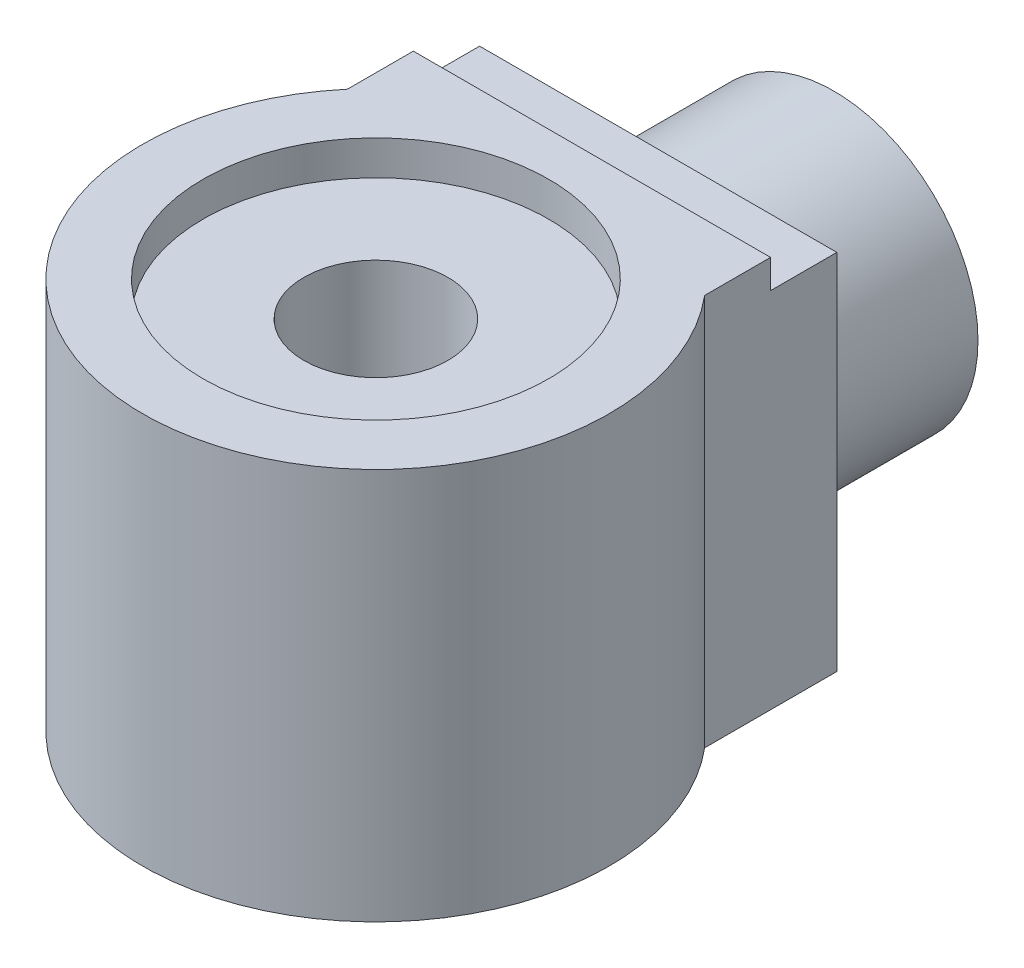
ISO-10303-21;
HEADER;
FILE_DESCRIPTION(('STEP AP214'),'2;1');
FILE_NAME('part.step','',(''),(''),'','','');
FILE_SCHEMA(('AUTOMOTIVE_DESIGN { 1 0 10303 214 1 1 1 1 }'));
ENDSEC;
DATA;
#1=APPLICATION_CONTEXT('core data for automotive mechanical design processes');
#2=APPLICATION_PROTOCOL_DEFINITION('international standard','automotive_design',2000,#1);
#3=PRODUCT_CONTEXT('',#1,'mechanical');
#4=PRODUCT('Part','Part','',(#3));
#5=PRODUCT_RELATED_PRODUCT_CATEGORY('part','',(#4));
#6=PRODUCT_DEFINITION_FORMATION('','',#4);
#7=PRODUCT_DEFINITION_CONTEXT('part definition',#1,'design');
#8=PRODUCT_DEFINITION('design','',#6,#7);
#9=PRODUCT_DEFINITION_SHAPE('','',#8);
#10=(LENGTH_UNIT() NAMED_UNIT(*) SI_UNIT(.MILLI.,.METRE.));
#11=(NAMED_UNIT(*) PLANE_ANGLE_UNIT() SI_UNIT($,.RADIAN.));
#12=(NAMED_UNIT(*) SI_UNIT($,.STERADIAN.) SOLID_ANGLE_UNIT());
#13=UNCERTAINTY_MEASURE_WITH_UNIT(LENGTH_MEASURE(1.E-05),#10,'distance_accuracy_value','');
#14=(GEOMETRIC_REPRESENTATION_CONTEXT(3) GLOBAL_UNCERTAINTY_ASSIGNED_CONTEXT((#13)) GLOBAL_UNIT_ASSIGNED_CONTEXT((#10,
#11,#12)) REPRESENTATION_CONTEXT('',''));
#15=CARTESIAN_POINT('',(0.,0.,0.));
#16=DIRECTION('',(0.,0.,1.));
#17=DIRECTION('',(1.,0.,0.));
#18=AXIS2_PLACEMENT_3D('',#15,#16,#17);
#19=CARTESIAN_POINT('',(15.748,34.544,-24.892));
#20=DIRECTION('',(0.,0.,1.));
#21=DIRECTION('',(1.,0.,0.));
#22=AXIS2_PLACEMENT_3D('',#19,#20,#21);
#23=PLANE('',#22);
#24=CARTESIAN_POINT('',(0.,16.002,-24.892));
#25=DIRECTION('',(0.,0.,1.));
#26=DIRECTION('',(1.,0.,0.));
#27=AXIS2_PLACEMENT_3D('',#24,#25,#26);
#28=CIRCLE('',#27,12.7);
#29=CARTESIAN_POINT('',(12.7,16.002,-24.892));
#30=VERTEX_POINT('',#29);
#31=EDGE_CURVE('E11',#30,#30,#28,.F.);
#32=ORIENTED_EDGE('',*,*,#31,.F.);
#33=EDGE_LOOP('',(#32));
#34=FACE_BOUND('',#33,.T.);
#35=DIRECTION('',(-1.,0.,0.));
#36=VECTOR('',#35,1.);
#37=CARTESIAN_POINT('',(-15.748,32.004,-24.892));
#38=LINE('',#37,#36);
#39=CARTESIAN_POINT('',(15.748,32.004,-24.892));
#40=VERTEX_POINT('',#39);
#41=CARTESIAN_POINT('',(-15.748,32.004,-24.892));
#42=VERTEX_POINT('',#41);
#43=EDGE_CURVE('E119',#40,#42,#38,.T.);
#44=ORIENTED_EDGE('',*,*,#43,.F.);
#45=DIRECTION('',(0.,-1.,0.));
#46=VECTOR('',#45,1.);
#47=CARTESIAN_POINT('',(15.748,34.544,-24.892));
#48=LINE('',#47,#46);
#49=CARTESIAN_POINT('',(15.748,0.,-24.892));
#50=VERTEX_POINT('',#49);
#51=EDGE_CURVE('E43',#40,#50,#48,.T.);
#52=ORIENTED_EDGE('',*,*,#51,.T.);
#53=DIRECTION('',(-1.,0.,0.));
#54=VECTOR('',#53,1.);
#55=CARTESIAN_POINT('',(15.748,0.,-24.892));
#56=LINE('',#55,#54);
#57=CARTESIAN_POINT('',(-15.748,0.,-24.892));
#58=VERTEX_POINT('',#57);
#59=EDGE_CURVE('E101',#50,#58,#56,.T.);
#60=ORIENTED_EDGE('',*,*,#59,.T.);
#61=DIRECTION('',(0.,-1.,0.));
#62=VECTOR('',#61,1.);
#63=CARTESIAN_POINT('',(-15.748,34.544,-24.892));
#64=LINE('',#63,#62);
#65=EDGE_CURVE('E113',#42,#58,#64,.T.);
#66=ORIENTED_EDGE('',*,*,#65,.F.);
#67=EDGE_LOOP('',(#44,#52,#60,#66));
#68=FACE_BOUND('',#67,.T.);
#69=ADVANCED_FACE('F35',(#34,#68),#23,.F.);
#70=CARTESIAN_POINT('',(15.748,34.544,-24.892));
#71=DIRECTION('',(-1.,0.,0.));
#72=DIRECTION('',(0.,0.,1.));
#73=AXIS2_PLACEMENT_3D('',#70,#71,#72);
#74=PLANE('',#73);
#75=DIRECTION('',(0.,0.,-1.));
#76=VECTOR('',#75,1.);
#77=CARTESIAN_POINT('',(15.748,32.004,-24.892));
#78=LINE('',#77,#76);
#79=CARTESIAN_POINT('',(15.748,32.004,-19.05));
#80=VERTEX_POINT('',#79);
#81=EDGE_CURVE('E122',#80,#40,#78,.T.);
#82=ORIENTED_EDGE('',*,*,#81,.F.);
#83=DIRECTION('',(0.,1.,0.));
#84=VECTOR('',#83,1.);
#85=CARTESIAN_POINT('',(15.748,32.004,-19.05));
#86=LINE('',#85,#84);
#87=CARTESIAN_POINT('',(15.748,34.544,-19.05));
#88=VERTEX_POINT('',#87);
#89=EDGE_CURVE('E136',#80,#88,#86,.T.);
#90=ORIENTED_EDGE('',*,*,#89,.T.);
#91=DIRECTION('',(0.,0.,-1.));
#92=VECTOR('',#91,1.);
#93=CARTESIAN_POINT('',(15.748,34.544,-24.892));
#94=LINE('',#93,#92);
#95=CARTESIAN_POINT('',(15.748,34.544,-13.2397119304009));
#96=VERTEX_POINT('',#95);
#97=EDGE_CURVE('E88',#96,#88,#94,.T.);
#98=ORIENTED_EDGE('',*,*,#97,.F.);
#99=DIRECTION('',(0.,-1.,0.));
#100=VECTOR('',#99,1.);
#101=CARTESIAN_POINT('',(15.748,34.544,-13.2397119304009));
#102=LINE('',#101,#100);
#103=CARTESIAN_POINT('',(15.748,0.,-13.2397119304009));
#104=VERTEX_POINT('',#103);
#105=EDGE_CURVE('E81',#96,#104,#102,.T.);
#106=ORIENTED_EDGE('',*,*,#105,.T.);
#107=DIRECTION('',(0.,0.,-1.));
#108=VECTOR('',#107,1.);
#109=CARTESIAN_POINT('',(15.748,0.,-24.892));
#110=LINE('',#109,#108);
#111=EDGE_CURVE('E95',#104,#50,#110,.T.);
#112=ORIENTED_EDGE('',*,*,#111,.T.);
#113=ORIENTED_EDGE('',*,*,#51,.F.);
#114=EDGE_LOOP('',(#82,#90,#98,#106,#112,#113));
#115=FACE_BOUND('',#114,.T.);
#116=ADVANCED_FACE('F37',(#115),#74,.F.);
#117=CARTESIAN_POINT('',(-15.748,34.544,-24.892));
#118=DIRECTION('',(1.,0.,0.));
#119=DIRECTION('',(0.,0.,-1.));
#120=AXIS2_PLACEMENT_3D('',#117,#118,#119);
#121=PLANE('',#120);
#122=DIRECTION('',(0.,0.,1.));
#123=VECTOR('',#122,1.);
#124=CARTESIAN_POINT('',(-15.748,34.544,-24.892));
#125=LINE('',#124,#123);
#126=CARTESIAN_POINT('',(-15.748,34.544,-19.05));
#127=VERTEX_POINT('',#126);
#128=CARTESIAN_POINT('',(-15.748,34.544,-13.2397119304009));
#129=VERTEX_POINT('',#128);
#130=EDGE_CURVE('E145',#127,#129,#125,.T.);
#131=ORIENTED_EDGE('',*,*,#130,.F.);
#132=DIRECTION('',(0.,1.,0.));
#133=VECTOR('',#132,1.);
#134=CARTESIAN_POINT('',(-15.748,32.004,-19.05));
#135=LINE('',#134,#133);
#136=CARTESIAN_POINT('',(-15.748,32.004,-19.05));
#137=VERTEX_POINT('',#136);
#138=EDGE_CURVE('E50',#137,#127,#135,.T.);
#139=ORIENTED_EDGE('',*,*,#138,.F.);
#140=DIRECTION('',(0.,0.,1.));
#141=VECTOR('',#140,1.);
#142=CARTESIAN_POINT('',(-15.748,32.004,-24.892));
#143=LINE('',#142,#141);
#144=EDGE_CURVE('E137',#42,#137,#143,.T.);
#145=ORIENTED_EDGE('',*,*,#144,.F.);
#146=ORIENTED_EDGE('',*,*,#65,.T.);
#147=DIRECTION('',(0.,0.,1.));
#148=VECTOR('',#147,1.);
#149=CARTESIAN_POINT('',(-15.748,0.,-24.892));
#150=LINE('',#149,#148);
#151=CARTESIAN_POINT('',(-15.748,0.,-13.2397119304009));
#152=VERTEX_POINT('',#151);
#153=EDGE_CURVE('E89',#58,#152,#150,.T.);
#154=ORIENTED_EDGE('',*,*,#153,.T.);
#155=DIRECTION('',(0.,-1.,0.));
#156=VECTOR('',#155,1.);
#157=CARTESIAN_POINT('',(-15.748,34.544,-13.2397119304009));
#158=LINE('',#157,#156);
#159=EDGE_CURVE('E84',#129,#152,#158,.T.);
#160=ORIENTED_EDGE('',*,*,#159,.F.);
#161=EDGE_LOOP('',(#131,#139,#145,#146,#154,#160));
#162=FACE_BOUND('',#161,.T.);
#163=ADVANCED_FACE('F144',(#162),#121,.F.);
#164=CARTESIAN_POINT('',(0.,34.544,0.));
#165=DIRECTION('',(0.,-1.,0.));
#166=DIRECTION('',(0.,0.,-1.));
#167=AXIS2_PLACEMENT_3D('',#164,#165,#166);
#168=CYLINDRICAL_SURFACE('',#167,20.574);
#169=CARTESIAN_POINT('',(0.,0.,0.));
#170=DIRECTION('',(0.,1.,0.));
#171=DIRECTION('',(0.,0.,1.));
#172=AXIS2_PLACEMENT_3D('',#169,#170,#171);
#173=CIRCLE('',#172,20.574);
#174=EDGE_CURVE('E78',#152,#104,#173,.T.);
#175=ORIENTED_EDGE('',*,*,#174,.T.);
#176=ORIENTED_EDGE('',*,*,#105,.F.);
#177=CARTESIAN_POINT('',(0.,34.544,0.));
#178=DIRECTION('',(0.,1.,0.));
#179=DIRECTION('',(0.,0.,1.));
#180=AXIS2_PLACEMENT_3D('',#177,#178,#179);
#181=CIRCLE('',#180,20.574);
#182=EDGE_CURVE('E59',#129,#96,#181,.T.);
#183=ORIENTED_EDGE('',*,*,#182,.F.);
#184=ORIENTED_EDGE('',*,*,#159,.T.);
#185=EDGE_LOOP('',(#175,#176,#183,#184));
#186=FACE_BOUND('',#185,.T.);
#187=ADVANCED_FACE('F80',(#186),#168,.T.);
#188=CARTESIAN_POINT('',(0.,34.544,0.));
#189=DIRECTION('',(0.,1.,0.));
#190=DIRECTION('',(0.,0.,1.));
#191=AXIS2_PLACEMENT_3D('',#188,#189,#190);
#192=PLANE('',#191);
#193=DIRECTION('',(1.,0.,0.));
#194=VECTOR('',#193,1.);
#195=CARTESIAN_POINT('',(-15.748,34.544,-19.05));
#196=LINE('',#195,#194);
#197=EDGE_CURVE('E132',#127,#88,#196,.T.);
#198=ORIENTED_EDGE('',*,*,#197,.F.);
#199=ORIENTED_EDGE('',*,*,#130,.T.);
#200=ORIENTED_EDGE('',*,*,#182,.T.);
#201=ORIENTED_EDGE('',*,*,#97,.T.);
#202=EDGE_LOOP('',(#198,#199,#200,#201));
#203=FACE_BOUND('',#202,.T.);
#204=CARTESIAN_POINT('',(0.,34.544,0.));
#205=DIRECTION('',(0.,1.,0.));
#206=DIRECTION('',(0.,0.,1.));
#207=AXIS2_PLACEMENT_3D('',#204,#205,#206);
#208=CIRCLE('',#207,15.24);
#209=CARTESIAN_POINT('',(0.,34.544,15.24));
#210=VERTEX_POINT('',#209);
#211=EDGE_CURVE('E106',#210,#210,#208,.T.);
#212=ORIENTED_EDGE('',*,*,#211,.F.);
#213=EDGE_LOOP('',(#212));
#214=FACE_BOUND('',#213,.T.);
#215=ADVANCED_FACE('F159',(#203,#214),#192,.T.);
#216=CARTESIAN_POINT('',(0.,0.,0.));
#217=DIRECTION('',(0.,1.,0.));
#218=DIRECTION('',(0.,0.,1.));
#219=AXIS2_PLACEMENT_3D('',#216,#217,#218);
#220=PLANE('',#219);
#221=CARTESIAN_POINT('',(0.,0.,0.));
#222=DIRECTION('',(0.,1.,0.));
#223=DIRECTION('',(0.,0.,1.));
#224=AXIS2_PLACEMENT_3D('',#221,#222,#223);
#225=CIRCLE('',#224,6.34999999999999);
#226=CARTESIAN_POINT('',(0.,0.,6.34999999999999));
#227=VERTEX_POINT('',#226);
#228=EDGE_CURVE('E154',#227,#227,#225,.T.);
#229=ORIENTED_EDGE('',*,*,#228,.T.);
#230=EDGE_LOOP('',(#229));
#231=FACE_BOUND('',#230,.T.);
#232=ORIENTED_EDGE('',*,*,#111,.F.);
#233=ORIENTED_EDGE('',*,*,#174,.F.);
#234=ORIENTED_EDGE('',*,*,#153,.F.);
#235=ORIENTED_EDGE('',*,*,#59,.F.);
#236=EDGE_LOOP('',(#232,#233,#234,#235));
#237=FACE_BOUND('',#236,.T.);
#238=ADVANCED_FACE('F99',(#231,#237),#220,.F.);
#239=CARTESIAN_POINT('',(0.,31.496,0.));
#240=DIRECTION('',(0.,1.,0.));
#241=DIRECTION('',(0.,0.,1.));
#242=AXIS2_PLACEMENT_3D('',#239,#240,#241);
#243=CYLINDRICAL_SURFACE('',#242,15.24);
#244=CARTESIAN_POINT('',(0.,31.496,0.));
#245=DIRECTION('',(0.,1.,0.));
#246=DIRECTION('',(0.,0.,1.));
#247=AXIS2_PLACEMENT_3D('',#244,#245,#246);
#248=CIRCLE('',#247,15.24);
#249=CARTESIAN_POINT('',(0.,31.496,15.24));
#250=VERTEX_POINT('',#249);
#251=EDGE_CURVE('E102',#250,#250,#248,.T.);
#252=CARTESIAN_POINT('',(0.,31.496,15.24));
#253=CARTESIAN_POINT('',(0.,31.52775,15.24));
#254=CARTESIAN_POINT('',(0.,31.5595,15.24));
#255=CARTESIAN_POINT('',(0.,31.623,15.24));
#256=CARTESIAN_POINT('',(0.,31.65475,15.24));
#257=CARTESIAN_POINT('',(0.,31.71825,15.24));
#258=CARTESIAN_POINT('',(0.,31.75,15.24));
#259=CARTESIAN_POINT('',(0.,31.8135,15.24));
#260=CARTESIAN_POINT('',(0.,31.84525,15.24));
#261=CARTESIAN_POINT('',(0.,31.90875,15.24));
#262=CARTESIAN_POINT('',(0.,31.9405,15.24));
#263=CARTESIAN_POINT('',(0.,32.004,15.24));
#264=CARTESIAN_POINT('',(0.,32.03575,15.24));
#265=CARTESIAN_POINT('',(0.,32.09925,15.24));
#266=CARTESIAN_POINT('',(0.,32.131,15.24));
#267=CARTESIAN_POINT('',(0.,32.1945,15.24));
#268=CARTESIAN_POINT('',(0.,32.22625,15.24));
#269=CARTESIAN_POINT('',(0.,32.28975,15.24));
#270=CARTESIAN_POINT('',(0.,32.3215,15.24));
#271=CARTESIAN_POINT('',(0.,32.385,15.24));
#272=CARTESIAN_POINT('',(0.,32.41675,15.24));
#273=CARTESIAN_POINT('',(0.,32.48025,15.24));
#274=CARTESIAN_POINT('',(0.,32.512,15.24));
#275=CARTESIAN_POINT('',(0.,32.5755,15.24));
#276=CARTESIAN_POINT('',(0.,32.60725,15.24));
#277=CARTESIAN_POINT('',(0.,32.67075,15.24));
#278=CARTESIAN_POINT('',(0.,32.7025,15.24));
#279=CARTESIAN_POINT('',(0.,32.766,15.24));
#280=CARTESIAN_POINT('',(0.,32.79775,15.24));
#281=CARTESIAN_POINT('',(0.,32.86125,15.24));
#282=CARTESIAN_POINT('',(0.,32.893,15.24));
#283=CARTESIAN_POINT('',(0.,32.9565,15.24));
#284=CARTESIAN_POINT('',(0.,32.98825,15.24));
#285=CARTESIAN_POINT('',(0.,33.05175,15.24));
#286=CARTESIAN_POINT('',(0.,33.0835,15.24));
#287=CARTESIAN_POINT('',(0.,33.147,15.24));
#288=CARTESIAN_POINT('',(0.,33.17875,15.24));
#289=CARTESIAN_POINT('',(0.,33.24225,15.24));
#290=CARTESIAN_POINT('',(0.,33.274,15.24));
#291=CARTESIAN_POINT('',(0.,33.3375,15.24));
#292=CARTESIAN_POINT('',(0.,33.36925,15.24));
#293=CARTESIAN_POINT('',(0.,33.43275,15.24));
#294=CARTESIAN_POINT('',(0.,33.4645,15.24));
#295=CARTESIAN_POINT('',(0.,33.528,15.24));
#296=CARTESIAN_POINT('',(0.,33.55975,15.24));
#297=CARTESIAN_POINT('',(0.,33.62325,15.24));
#298=CARTESIAN_POINT('',(0.,33.655,15.24));
#299=CARTESIAN_POINT('',(0.,33.7185,15.24));
#300=CARTESIAN_POINT('',(0.,33.75025,15.24));
#301=CARTESIAN_POINT('',(0.,33.81375,15.24));
#302=CARTESIAN_POINT('',(0.,33.8455,15.24));
#303=CARTESIAN_POINT('',(0.,33.909,15.24));
#304=CARTESIAN_POINT('',(0.,33.94075,15.24));
#305=CARTESIAN_POINT('',(0.,34.00425,15.24));
#306=CARTESIAN_POINT('',(0.,34.036,15.24));
#307=CARTESIAN_POINT('',(0.,34.0995,15.24));
#308=CARTESIAN_POINT('',(0.,34.13125,15.24));
#309=CARTESIAN_POINT('',(0.,34.19475,15.24));
#310=CARTESIAN_POINT('',(0.,34.2265,15.24));
#311=CARTESIAN_POINT('',(0.,34.29,15.24));
#312=CARTESIAN_POINT('',(0.,34.32175,15.24));
#313=CARTESIAN_POINT('',(0.,34.38525,15.24));
#314=CARTESIAN_POINT('',(0.,34.417,15.24));
#315=CARTESIAN_POINT('',(0.,34.4805,15.24));
#316=CARTESIAN_POINT('',(0.,34.51225,15.24));
#317=CARTESIAN_POINT('',(0.,34.544,15.24));
#318=B_SPLINE_CURVE_WITH_KNOTS('',3,(#252,#253,#254,#255,#256,#257,#258,#259,#260,#261,#262,
#263,#264,#265,#266,#267,#268,#269,#270,#271,#272,#273,#274,#275,#276,#277,#278,#279,#280,#281,
#282,#283,#284,#285,#286,#287,#288,#289,#290,#291,#292,#293,#294,#295,#296,#297,#298,#299,#300,
#301,#302,#303,#304,#305,#306,#307,#308,#309,#310,#311,#312,#313,#314,#315,#316,#317),
.UNSPECIFIED.,.F.,.F.,(4,2,2,2,2,2,2,2,2,2,2,2,2,2,2,2,2,2,2,2,2,2,2,2,2,2,2,2,2,2,2,2,4),(0.,
0.0952500000000051,0.190500000000003,0.285750000000001,0.381000000000006,0.476250000000004,
0.571500000000003,0.666750000000001,0.762000000000006,0.857250000000004,0.952500000000002,
1.04775000000001,1.14300000000001,1.23825,1.3335,1.42875000000001,1.524,1.61925,
1.71450000000001,1.80975000000001,1.905,2.00025,2.09550000000001,2.19075000000001,2.286,
2.38125000000001,2.47650000000001,2.57175,2.667,2.76225000000001,2.85750000000001,2.95275,
3.04800000000001),.UNSPECIFIED.);
#319=EDGE_CURVE('BSEAM217',#250,#210,#318,.T.);
#320=ORIENTED_EDGE('',*,*,#251,.F.);
#321=ORIENTED_EDGE('',*,*,#211,.T.);
#322=ORIENTED_EDGE('',*,*,#319,.T.);
#323=ORIENTED_EDGE('',*,*,#319,.F.);
#324=EDGE_LOOP('',(#320,#322,#321,#323));
#325=FACE_BOUND('',#324,.T.);
#326=ADVANCED_FACE('F217',(#325),#243,.F.);
#327=CARTESIAN_POINT('',(0.,31.496,0.));
#328=DIRECTION('',(0.,1.,0.));
#329=DIRECTION('',(0.,0.,1.));
#330=AXIS2_PLACEMENT_3D('',#327,#328,#329);
#331=PLANE('',#330);
#332=CARTESIAN_POINT('',(0.,31.496,0.));
#333=DIRECTION('',(0.,1.,0.));
#334=DIRECTION('',(0.,0.,1.));
#335=AXIS2_PLACEMENT_3D('',#332,#333,#334);
#336=CIRCLE('',#335,6.35);
#337=CARTESIAN_POINT('',(0.,31.496,6.35));
#338=VERTEX_POINT('',#337);
#339=EDGE_CURVE('E147',#338,#338,#336,.T.);
#340=ORIENTED_EDGE('',*,*,#339,.F.);
#341=EDGE_LOOP('',(#340));
#342=FACE_BOUND('',#341,.T.);
#343=ORIENTED_EDGE('',*,*,#251,.T.);
#344=EDGE_LOOP('',(#343));
#345=FACE_BOUND('',#344,.T.);
#346=ADVANCED_FACE('F223',(#342,#345),#331,.T.);
#347=CARTESIAN_POINT('',(0.,31.496,0.));
#348=DIRECTION('',(0.,1.,0.));
#349=DIRECTION('',(0.,0.,1.));
#350=AXIS2_PLACEMENT_3D('',#347,#348,#349);
#351=CYLINDRICAL_SURFACE('',#350,6.34999999999999);
#352=ORIENTED_EDGE('',*,*,#228,.F.);
#353=EDGE_LOOP('',(#352));
#354=FACE_BOUND('',#353,.T.);
#355=ORIENTED_EDGE('',*,*,#339,.T.);
#356=EDGE_LOOP('',(#355));
#357=FACE_BOUND('',#356,.T.);
#358=ADVANCED_FACE('F227',(#354,#357),#351,.F.);
#359=CARTESIAN_POINT('',(-15.748,32.004,-19.05));
#360=DIRECTION('',(0.,0.,1.));
#361=DIRECTION('',(1.,0.,0.));
#362=AXIS2_PLACEMENT_3D('',#359,#360,#361);
#363=PLANE('',#362);
#364=ORIENTED_EDGE('',*,*,#197,.T.);
#365=ORIENTED_EDGE('',*,*,#89,.F.);
#366=DIRECTION('',(1.,0.,0.));
#367=VECTOR('',#366,1.);
#368=CARTESIAN_POINT('',(-15.748,32.004,-19.05));
#369=LINE('',#368,#367);
#370=EDGE_CURVE('E133',#137,#80,#369,.T.);
#371=ORIENTED_EDGE('',*,*,#370,.F.);
#372=ORIENTED_EDGE('',*,*,#138,.T.);
#373=EDGE_LOOP('',(#364,#365,#371,#372));
#374=FACE_BOUND('',#373,.T.);
#375=ADVANCED_FACE('F135',(#374),#363,.F.);
#376=CARTESIAN_POINT('',(0.,32.004,0.));
#377=DIRECTION('',(0.,1.,0.));
#378=DIRECTION('',(0.,0.,1.));
#379=AXIS2_PLACEMENT_3D('',#376,#377,#378);
#380=PLANE('',#379);
#381=ORIENTED_EDGE('',*,*,#144,.T.);
#382=ORIENTED_EDGE('',*,*,#370,.T.);
#383=ORIENTED_EDGE('',*,*,#81,.T.);
#384=ORIENTED_EDGE('',*,*,#43,.T.);
#385=EDGE_LOOP('',(#381,#382,#383,#384));
#386=FACE_BOUND('',#385,.T.);
#387=ADVANCED_FACE('F140',(#386),#380,.T.);
#388=CARTESIAN_POINT('',(0.,16.002,-40.386));
#389=DIRECTION('',(0.,0.,-1.));
#390=DIRECTION('',(-1.,0.,0.));
#391=AXIS2_PLACEMENT_3D('',#388,#389,#390);
#392=PLANE('',#391);
#393=CARTESIAN_POINT('',(0.,16.002,-40.386));
#394=DIRECTION('',(0.,0.,-1.));
#395=DIRECTION('',(-1.,0.,0.));
#396=AXIS2_PLACEMENT_3D('',#393,#394,#395);
#397=CIRCLE('',#396,10.668);
#398=CARTESIAN_POINT('',(-10.668,16.002,-40.386));
#399=VERTEX_POINT('',#398);
#400=EDGE_CURVE('E170',#399,#399,#397,.T.);
#401=ORIENTED_EDGE('',*,*,#400,.F.);
#402=EDGE_LOOP('',(#401));
#403=FACE_BOUND('',#402,.T.);
#404=CARTESIAN_POINT('',(0.,16.002,-40.386));
#405=DIRECTION('',(0.,0.,-1.));
#406=DIRECTION('',(-1.,0.,0.));
#407=AXIS2_PLACEMENT_3D('',#404,#405,#406);
#408=CIRCLE('',#407,12.7);
#409=CARTESIAN_POINT('',(-12.7,16.002,-40.386));
#410=VERTEX_POINT('',#409);
#411=EDGE_CURVE('E161',#410,#410,#408,.T.);
#412=ORIENTED_EDGE('',*,*,#411,.T.);
#413=EDGE_LOOP('',(#412));
#414=FACE_BOUND('',#413,.T.);
#415=ADVANCED_FACE('F195',(#403,#414),#392,.T.);
#416=CARTESIAN_POINT('',(0.,16.002,-40.386));
#417=DIRECTION('',(0.,0.,1.));
#418=DIRECTION('',(1.,0.,0.));
#419=AXIS2_PLACEMENT_3D('',#416,#417,#418);
#420=CYLINDRICAL_SURFACE('',#419,12.7);
#421=ORIENTED_EDGE('',*,*,#411,.F.);
#422=EDGE_LOOP('',(#421));
#423=FACE_BOUND('',#422,.T.);
#424=ORIENTED_EDGE('',*,*,#31,.T.);
#425=EDGE_LOOP('',(#424));
#426=FACE_BOUND('',#425,.T.);
#427=ADVANCED_FACE('F191',(#423,#426),#420,.T.);
#428=CARTESIAN_POINT('',(0.,16.002,-24.892));
#429=DIRECTION('',(0.,0.,-1.));
#430=DIRECTION('',(-1.,0.,0.));
#431=AXIS2_PLACEMENT_3D('',#428,#429,#430);
#432=CYLINDRICAL_SURFACE('',#431,10.668);
#433=CARTESIAN_POINT('',(0.,16.002,-24.892));
#434=DIRECTION('',(0.,0.,-1.));
#435=DIRECTION('',(-1.,0.,0.));
#436=AXIS2_PLACEMENT_3D('',#433,#434,#435);
#437=CIRCLE('',#436,10.668);
#438=CARTESIAN_POINT('',(-10.668,16.002,-24.892));
#439=VERTEX_POINT('',#438);
#440=EDGE_CURVE('E169',#439,#439,#437,.T.);
#441=ORIENTED_EDGE('',*,*,#440,.F.);
#442=EDGE_LOOP('',(#441));
#443=FACE_BOUND('',#442,.T.);
#444=ORIENTED_EDGE('',*,*,#400,.T.);
#445=EDGE_LOOP('',(#444));
#446=FACE_BOUND('',#445,.T.);
#447=ADVANCED_FACE('F185',(#443,#446),#432,.F.);
#448=CARTESIAN_POINT('',(0.,16.002,-24.892));
#449=DIRECTION('',(0.,0.,-1.));
#450=DIRECTION('',(-1.,0.,0.));
#451=AXIS2_PLACEMENT_3D('',#448,#449,#450);
#452=PLANE('',#451);
#453=CARTESIAN_POINT('',(0.,16.002,-24.892));
#454=DIRECTION('',(0.,0.,-1.));
#455=DIRECTION('',(-1.,0.,0.));
#456=AXIS2_PLACEMENT_3D('',#453,#454,#455);
#457=CIRCLE('',#456,6.477);
#458=CARTESIAN_POINT('',(6.477,16.002,-24.892));
#459=VERTEX_POINT('',#458);
#460=EDGE_CURVE('E173',#459,#459,#457,.T.);
#461=ORIENTED_EDGE('',*,*,#460,.F.);
#462=EDGE_LOOP('',(#461));
#463=FACE_BOUND('',#462,.T.);
#464=ORIENTED_EDGE('',*,*,#440,.T.);
#465=EDGE_LOOP('',(#464));
#466=FACE_BOUND('',#465,.T.);
#467=ADVANCED_FACE('F181',(#463,#466),#452,.T.);
#468=CARTESIAN_POINT('',(0.,16.002,-43.942));
#469=DIRECTION('',(0.,0.,-1.));
#470=DIRECTION('',(-1.,0.,0.));
#471=AXIS2_PLACEMENT_3D('',#468,#469,#470);
#472=PLANE('',#471);
#473=CARTESIAN_POINT('',(0.,16.002,-43.942));
#474=DIRECTION('',(0.,0.,-1.));
#475=DIRECTION('',(-1.,0.,0.));
#476=AXIS2_PLACEMENT_3D('',#473,#474,#475);
#477=CIRCLE('',#476,6.477);
#478=CARTESIAN_POINT('',(6.47699999999999,16.002,-43.942));
#479=VERTEX_POINT('',#478);
#480=EDGE_CURVE('E163',#479,#479,#477,.T.);
#481=ORIENTED_EDGE('',*,*,#480,.T.);
#482=EDGE_LOOP('',(#481));
#483=FACE_BOUND('',#482,.T.);
#484=ADVANCED_FACE('F184',(#483),#472,.T.);
#485=CARTESIAN_POINT('',(0.,16.002,-43.942));
#486=DIRECTION('',(0.,0.,1.));
#487=DIRECTION('',(1.,0.,0.));
#488=AXIS2_PLACEMENT_3D('',#485,#486,#487);
#489=CYLINDRICAL_SURFACE('',#488,6.477);
#490=CARTESIAN_POINT('',(6.47699999999999,16.002,-43.942));
#491=CARTESIAN_POINT('',(6.47699999999999,16.002,-43.7435625));
#492=CARTESIAN_POINT('',(6.47699999999999,16.002,-43.545125));
#493=CARTESIAN_POINT('',(6.47699999999999,16.002,-43.14825));
#494=CARTESIAN_POINT('',(6.47699999999999,16.002,-42.9498125));
#495=CARTESIAN_POINT('',(6.47699999999999,16.002,-42.5529375));
#496=CARTESIAN_POINT('',(6.47699999999999,16.002,-42.3545));
#497=CARTESIAN_POINT('',(6.47699999999999,16.002,-41.957625));
#498=CARTESIAN_POINT('',(6.47699999999999,16.002,-41.7591875));
#499=CARTESIAN_POINT('',(6.47699999999999,16.002,-41.3623125));
#500=CARTESIAN_POINT('',(6.47699999999999,16.002,-41.163875));
#501=CARTESIAN_POINT('',(6.47699999999999,16.002,-40.767));
#502=CARTESIAN_POINT('',(6.47699999999999,16.002,-40.5685625));
#503=CARTESIAN_POINT('',(6.47699999999999,16.002,-40.1716875));
#504=CARTESIAN_POINT('',(6.47699999999999,16.002,-39.97325));
#505=CARTESIAN_POINT('',(6.47699999999999,16.002,-39.576375));
#506=CARTESIAN_POINT('',(6.47699999999999,16.002,-39.3779375));
#507=CARTESIAN_POINT('',(6.47699999999999,16.002,-38.9810625));
#508=CARTESIAN_POINT('',(6.47699999999999,16.002,-38.782625));
#509=CARTESIAN_POINT('',(6.47699999999999,16.002,-38.38575));
#510=CARTESIAN_POINT('',(6.477,16.002,-38.1873125));
#511=CARTESIAN_POINT('',(6.477,16.002,-37.7904375));
#512=CARTESIAN_POINT('',(6.477,16.002,-37.592));
#513=CARTESIAN_POINT('',(6.477,16.002,-37.195125));
#514=CARTESIAN_POINT('',(6.477,16.002,-36.9966875));
#515=CARTESIAN_POINT('',(6.477,16.002,-36.5998125));
#516=CARTESIAN_POINT('',(6.477,16.002,-36.401375));
#517=CARTESIAN_POINT('',(6.477,16.002,-36.0045));
#518=CARTESIAN_POINT('',(6.477,16.002,-35.8060625));
#519=CARTESIAN_POINT('',(6.477,16.002,-35.4091875));
#520=CARTESIAN_POINT('',(6.477,16.002,-35.21075));
#521=CARTESIAN_POINT('',(6.477,16.002,-34.813875));
#522=CARTESIAN_POINT('',(6.477,16.002,-34.6154375));
#523=CARTESIAN_POINT('',(6.477,16.002,-34.2185625));
#524=CARTESIAN_POINT('',(6.477,16.002,-34.020125));
#525=CARTESIAN_POINT('',(6.477,16.002,-33.62325));
#526=CARTESIAN_POINT('',(6.477,16.002,-33.4248125));
#527=CARTESIAN_POINT('',(6.477,16.002,-33.0279375));
#528=CARTESIAN_POINT('',(6.477,16.002,-32.8295));
#529=CARTESIAN_POINT('',(6.477,16.002,-32.432625));
#530=CARTESIAN_POINT('',(6.477,16.002,-32.2341875));
#531=CARTESIAN_POINT('',(6.477,16.002,-31.8373125));
#532=CARTESIAN_POINT('',(6.477,16.002,-31.638875));
#533=CARTESIAN_POINT('',(6.477,16.002,-31.242));
#534=CARTESIAN_POINT('',(6.477,16.002,-31.0435625));
#535=CARTESIAN_POINT('',(6.477,16.002,-30.6466875));
#536=CARTESIAN_POINT('',(6.477,16.002,-30.44825));
#537=CARTESIAN_POINT('',(6.477,16.002,-30.051375));
#538=CARTESIAN_POINT('',(6.477,16.002,-29.8529375));
#539=CARTESIAN_POINT('',(6.477,16.002,-29.4560625));
#540=CARTESIAN_POINT('',(6.477,16.002,-29.257625));
#541=CARTESIAN_POINT('',(6.477,16.002,-28.86075));
#542=CARTESIAN_POINT('',(6.477,16.002,-28.6623125));
#543=CARTESIAN_POINT('',(6.477,16.002,-28.2654375));
#544=CARTESIAN_POINT('',(6.477,16.002,-28.067));
#545=CARTESIAN_POINT('',(6.477,16.002,-27.670125));
#546=CARTESIAN_POINT('',(6.477,16.002,-27.4716875));
#547=CARTESIAN_POINT('',(6.477,16.002,-27.0748125));
#548=CARTESIAN_POINT('',(6.477,16.002,-26.876375));
#549=CARTESIAN_POINT('',(6.477,16.002,-26.4795));
#550=CARTESIAN_POINT('',(6.477,16.002,-26.2810625));
#551=CARTESIAN_POINT('',(6.477,16.002,-25.8841875));
#552=CARTESIAN_POINT('',(6.477,16.002,-25.68575));
#553=CARTESIAN_POINT('',(6.477,16.002,-25.288875));
#554=CARTESIAN_POINT('',(6.477,16.002,-25.0904375));
#555=CARTESIAN_POINT('',(6.477,16.002,-24.892));
#556=B_SPLINE_CURVE_WITH_KNOTS('',3,(#490,#491,#492,#493,#494,#495,#496,#497,#498,#499,#500,
#501,#502,#503,#504,#505,#506,#507,#508,#509,#510,#511,#512,#513,#514,#515,#516,#517,#518,#519,
#520,#521,#522,#523,#524,#525,#526,#527,#528,#529,#530,#531,#532,#533,#534,#535,#536,#537,#538,
#539,#540,#541,#542,#543,#544,#545,#546,#547,#548,#549,#550,#551,#552,#553,#554,#555),
.UNSPECIFIED.,.F.,.F.,(4,2,2,2,2,2,2,2,2,2,2,2,2,2,2,2,2,2,2,2,2,2,2,2,2,2,2,2,2,2,2,2,4),(0.,
0.5953125,1.190625,1.7859375,2.38125,2.9765625,3.571875,4.1671875,4.7625,5.3578125,5.953125,
6.5484375,7.14375,7.7390625,8.334375,8.92968750000001,9.52500000000001,10.1203125,10.715625,
11.3109375,11.90625,12.5015625,13.096875,13.6921875,14.2875,14.8828125,15.478125,16.0734375,
16.66875,17.2640625,17.859375,18.4546875,19.05),.UNSPECIFIED.);
#557=EDGE_CURVE('BSEAM179',#479,#459,#556,.T.);
#558=ORIENTED_EDGE('',*,*,#480,.F.);
#559=ORIENTED_EDGE('',*,*,#460,.T.);
#560=ORIENTED_EDGE('',*,*,#557,.T.);
#561=ORIENTED_EDGE('',*,*,#557,.F.);
#562=EDGE_LOOP('',(#558,#560,#559,#561));
#563=FACE_BOUND('',#562,.T.);
#564=ADVANCED_FACE('F179',(#563),#489,.T.);
#565=CLOSED_SHELL('',(#69,#116,#163,#187,#215,#238,#326,#346,#358,#375,#387,#415,#427,#447,#467,
#484,#564));
#566=MANIFOLD_SOLID_BREP('B2',#565);
#567=ADVANCED_BREP_SHAPE_REPRESENTATION('',(#18,#566),#14);
#568=SHAPE_DEFINITION_REPRESENTATION(#9,#567);
ENDSEC;
END-ISO-10303-21;
